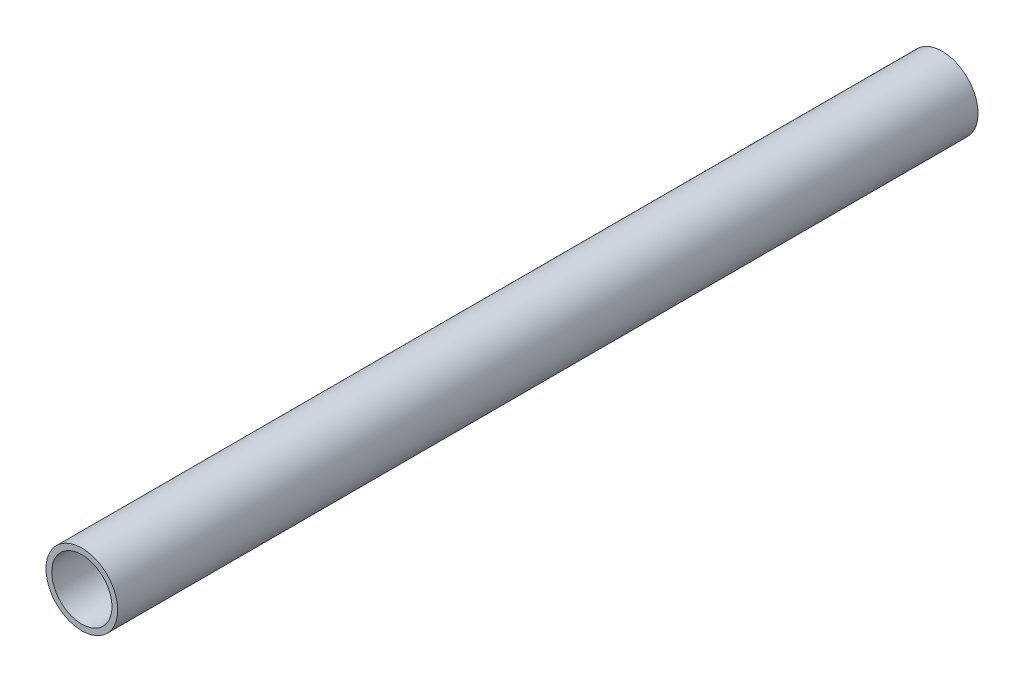
ISO-10303-21;
HEADER;
FILE_DESCRIPTION(('STEP AP214'),'2;1');
FILE_NAME('part.step','',(''),(''),'','','');
FILE_SCHEMA(('AUTOMOTIVE_DESIGN { 1 0 10303 214 1 1 1 1 }'));
ENDSEC;
DATA;
#1=APPLICATION_CONTEXT('core data for automotive mechanical design processes');
#2=APPLICATION_PROTOCOL_DEFINITION('international standard','automotive_design',2000,#1);
#3=PRODUCT_CONTEXT('',#1,'mechanical');
#4=PRODUCT('Part','Part','',(#3));
#5=PRODUCT_RELATED_PRODUCT_CATEGORY('part','',(#4));
#6=PRODUCT_DEFINITION_FORMATION('','',#4);
#7=PRODUCT_DEFINITION_CONTEXT('part definition',#1,'design');
#8=PRODUCT_DEFINITION('design','',#6,#7);
#9=PRODUCT_DEFINITION_SHAPE('','',#8);
#10=(LENGTH_UNIT() NAMED_UNIT(*) SI_UNIT(.MILLI.,.METRE.));
#11=(NAMED_UNIT(*) PLANE_ANGLE_UNIT() SI_UNIT($,.RADIAN.));
#12=(NAMED_UNIT(*) SI_UNIT($,.STERADIAN.) SOLID_ANGLE_UNIT());
#13=UNCERTAINTY_MEASURE_WITH_UNIT(LENGTH_MEASURE(1.E-05),#10,'distance_accuracy_value','');
#14=(GEOMETRIC_REPRESENTATION_CONTEXT(3) GLOBAL_UNCERTAINTY_ASSIGNED_CONTEXT((#13)) GLOBAL_UNIT_ASSIGNED_CONTEXT((#10,
#11,#12)) REPRESENTATION_CONTEXT('',''));
#15=CARTESIAN_POINT('',(0.,0.,0.));
#16=DIRECTION('',(0.,0.,1.));
#17=DIRECTION('',(1.,0.,0.));
#18=AXIS2_PLACEMENT_3D('',#15,#16,#17);
#19=CARTESIAN_POINT('',(0.,0.,304.8));
#20=DIRECTION('',(0.,0.,1.));
#21=DIRECTION('',(1.,0.,0.));
#22=AXIS2_PLACEMENT_3D('',#19,#20,#21);
#23=PLANE('',#22);
#24=CARTESIAN_POINT('',(0.,0.,304.8));
#25=DIRECTION('',(0.,0.,1.));
#26=DIRECTION('',(1.,0.,0.));
#27=AXIS2_PLACEMENT_3D('',#24,#25,#26);
#28=CIRCLE('',#27,12.7);
#29=CARTESIAN_POINT('',(-12.7,0.,304.8));
#30=VERTEX_POINT('',#29);
#31=EDGE_CURVE('E10',#30,#30,#28,.T.);
#32=ORIENTED_EDGE('',*,*,#31,.T.);
#33=EDGE_LOOP('',(#32));
#34=FACE_BOUND('',#33,.T.);
#35=CARTESIAN_POINT('',(0.,0.,304.8));
#36=DIRECTION('',(0.,0.,1.));
#37=DIRECTION('',(1.,0.,0.));
#38=AXIS2_PLACEMENT_3D('',#35,#36,#37);
#39=CIRCLE('',#38,10.668);
#40=CARTESIAN_POINT('',(-10.668,0.,304.8));
#41=VERTEX_POINT('',#40);
#42=EDGE_CURVE('E42',#41,#41,#39,.T.);
#43=ORIENTED_EDGE('',*,*,#42,.F.);
#44=EDGE_LOOP('',(#43));
#45=FACE_BOUND('',#44,.T.);
#46=ADVANCED_FACE('F31',(#34,#45),#23,.T.);
#47=CARTESIAN_POINT('',(0.,0.,0.));
#48=DIRECTION('',(0.,0.,1.));
#49=DIRECTION('',(1.,0.,0.));
#50=AXIS2_PLACEMENT_3D('',#47,#48,#49);
#51=PLANE('',#50);
#52=CARTESIAN_POINT('',(0.,0.,0.));
#53=DIRECTION('',(0.,0.,1.));
#54=DIRECTION('',(1.,0.,0.));
#55=AXIS2_PLACEMENT_3D('',#52,#53,#54);
#56=CIRCLE('',#55,12.7);
#57=CARTESIAN_POINT('',(-12.7,0.,0.));
#58=VERTEX_POINT('',#57);
#59=EDGE_CURVE('E35',#58,#58,#56,.T.);
#60=ORIENTED_EDGE('',*,*,#59,.F.);
#61=EDGE_LOOP('',(#60));
#62=FACE_BOUND('',#61,.T.);
#63=CARTESIAN_POINT('',(0.,0.,0.));
#64=DIRECTION('',(0.,0.,1.));
#65=DIRECTION('',(1.,0.,0.));
#66=AXIS2_PLACEMENT_3D('',#63,#64,#65);
#67=CIRCLE('',#66,10.668);
#68=CARTESIAN_POINT('',(-10.668,0.,0.));
#69=VERTEX_POINT('',#68);
#70=EDGE_CURVE('E44',#69,#69,#67,.T.);
#71=ORIENTED_EDGE('',*,*,#70,.T.);
#72=EDGE_LOOP('',(#71));
#73=FACE_BOUND('',#72,.T.);
#74=ADVANCED_FACE('F54',(#62,#73),#51,.F.);
#75=CARTESIAN_POINT('',(0.,0.,304.8));
#76=DIRECTION('',(0.,0.,-1.));
#77=DIRECTION('',(-1.,0.,0.));
#78=AXIS2_PLACEMENT_3D('',#75,#76,#77);
#79=CYLINDRICAL_SURFACE('',#78,12.7);
#80=CARTESIAN_POINT('',(-12.7,0.,304.8));
#81=CARTESIAN_POINT('',(-12.7,0.,301.625));
#82=CARTESIAN_POINT('',(-12.7,0.,298.45));
#83=CARTESIAN_POINT('',(-12.7,0.,292.1));
#84=CARTESIAN_POINT('',(-12.7,0.,288.925));
#85=CARTESIAN_POINT('',(-12.7,0.,282.575));
#86=CARTESIAN_POINT('',(-12.7,0.,279.4));
#87=CARTESIAN_POINT('',(-12.7,0.,273.05));
#88=CARTESIAN_POINT('',(-12.7,0.,269.875));
#89=CARTESIAN_POINT('',(-12.7,0.,263.525));
#90=CARTESIAN_POINT('',(-12.7,0.,260.35));
#91=CARTESIAN_POINT('',(-12.7,0.,254.));
#92=CARTESIAN_POINT('',(-12.7,0.,250.825));
#93=CARTESIAN_POINT('',(-12.7,0.,244.475));
#94=CARTESIAN_POINT('',(-12.7,0.,241.3));
#95=CARTESIAN_POINT('',(-12.7,0.,234.95));
#96=CARTESIAN_POINT('',(-12.7,0.,231.775));
#97=CARTESIAN_POINT('',(-12.7,0.,225.425));
#98=CARTESIAN_POINT('',(-12.7,0.,222.25));
#99=CARTESIAN_POINT('',(-12.7,0.,215.9));
#100=CARTESIAN_POINT('',(-12.7,0.,212.725));
#101=CARTESIAN_POINT('',(-12.7,0.,206.375));
#102=CARTESIAN_POINT('',(-12.7,0.,203.2));
#103=CARTESIAN_POINT('',(-12.7,0.,196.85));
#104=CARTESIAN_POINT('',(-12.7,0.,193.675));
#105=CARTESIAN_POINT('',(-12.7,0.,187.325));
#106=CARTESIAN_POINT('',(-12.7,0.,184.15));
#107=CARTESIAN_POINT('',(-12.7,0.,177.8));
#108=CARTESIAN_POINT('',(-12.7,0.,174.625));
#109=CARTESIAN_POINT('',(-12.7,0.,168.275));
#110=CARTESIAN_POINT('',(-12.7,0.,165.1));
#111=CARTESIAN_POINT('',(-12.7,0.,158.75));
#112=CARTESIAN_POINT('',(-12.7,0.,155.575));
#113=CARTESIAN_POINT('',(-12.7,0.,149.225));
#114=CARTESIAN_POINT('',(-12.7,0.,146.05));
#115=CARTESIAN_POINT('',(-12.7,0.,139.7));
#116=CARTESIAN_POINT('',(-12.7,0.,136.525));
#117=CARTESIAN_POINT('',(-12.7,0.,130.175));
#118=CARTESIAN_POINT('',(-12.7,0.,127.));
#119=CARTESIAN_POINT('',(-12.7,0.,120.65));
#120=CARTESIAN_POINT('',(-12.7,0.,117.475));
#121=CARTESIAN_POINT('',(-12.7,0.,111.125));
#122=CARTESIAN_POINT('',(-12.7,0.,107.95));
#123=CARTESIAN_POINT('',(-12.7,0.,101.6));
#124=CARTESIAN_POINT('',(-12.7,0.,98.425));
#125=CARTESIAN_POINT('',(-12.7,0.,92.075));
#126=CARTESIAN_POINT('',(-12.7,0.,88.9));
#127=CARTESIAN_POINT('',(-12.7,0.,82.55));
#128=CARTESIAN_POINT('',(-12.7,0.,79.375));
#129=CARTESIAN_POINT('',(-12.7,0.,73.025));
#130=CARTESIAN_POINT('',(-12.7,0.,69.85));
#131=CARTESIAN_POINT('',(-12.7,0.,63.5));
#132=CARTESIAN_POINT('',(-12.7,0.,60.325));
#133=CARTESIAN_POINT('',(-12.7,0.,53.975));
#134=CARTESIAN_POINT('',(-12.7,0.,50.8));
#135=CARTESIAN_POINT('',(-12.7,0.,44.45));
#136=CARTESIAN_POINT('',(-12.7,0.,41.275));
#137=CARTESIAN_POINT('',(-12.7,0.,34.925));
#138=CARTESIAN_POINT('',(-12.7,0.,31.75));
#139=CARTESIAN_POINT('',(-12.7,0.,25.4));
#140=CARTESIAN_POINT('',(-12.7,0.,22.225));
#141=CARTESIAN_POINT('',(-12.7,0.,15.875));
#142=CARTESIAN_POINT('',(-12.7,0.,12.7));
#143=CARTESIAN_POINT('',(-12.7,0.,6.35));
#144=CARTESIAN_POINT('',(-12.7,0.,3.175));
#145=CARTESIAN_POINT('',(-12.7,0.,0.));
#146=B_SPLINE_CURVE_WITH_KNOTS('',3,(#80,#81,#82,#83,#84,#85,#86,#87,#88,#89,#90,#91,#92,#93,
#94,#95,#96,#97,#98,#99,#100,#101,#102,#103,#104,#105,#106,#107,#108,#109,#110,#111,#112,#113,
#114,#115,#116,#117,#118,#119,#120,#121,#122,#123,#124,#125,#126,#127,#128,#129,#130,#131,#132,
#133,#134,#135,#136,#137,#138,#139,#140,#141,#142,#143,#144,#145),.UNSPECIFIED.,.F.,.F.,(4,2,2,
2,2,2,2,2,2,2,2,2,2,2,2,2,2,2,2,2,2,2,2,2,2,2,2,2,2,2,2,2,4),(0.,9.52500000000001,19.05,28.575,
38.1,47.625,57.15,66.675,76.2,85.7250000000001,95.2500000000001,104.775,114.3,123.825,133.35,
142.875,152.4,161.925,171.45,180.975,190.5,200.025,209.55,219.075,228.6,238.125,247.65,257.175,
266.7,276.225,285.75,295.275,304.8),.UNSPECIFIED.);
#147=EDGE_CURVE('BSEAM33',#30,#58,#146,.T.);
#148=ORIENTED_EDGE('',*,*,#31,.F.);
#149=ORIENTED_EDGE('',*,*,#59,.T.);
#150=ORIENTED_EDGE('',*,*,#147,.T.);
#151=ORIENTED_EDGE('',*,*,#147,.F.);
#152=EDGE_LOOP('',(#148,#150,#149,#151));
#153=FACE_BOUND('',#152,.T.);
#154=ADVANCED_FACE('F33',(#153),#79,.T.);
#155=CARTESIAN_POINT('',(0.,0.,304.8));
#156=DIRECTION('',(0.,0.,-1.));
#157=DIRECTION('',(-1.,0.,0.));
#158=AXIS2_PLACEMENT_3D('',#155,#156,#157);
#159=CYLINDRICAL_SURFACE('',#158,10.668);
#160=CARTESIAN_POINT('',(-10.668,0.,304.8));
#161=CARTESIAN_POINT('',(-10.668,0.,301.625));
#162=CARTESIAN_POINT('',(-10.668,0.,298.45));
#163=CARTESIAN_POINT('',(-10.668,0.,292.1));
#164=CARTESIAN_POINT('',(-10.668,0.,288.925));
#165=CARTESIAN_POINT('',(-10.668,0.,282.575));
#166=CARTESIAN_POINT('',(-10.668,0.,279.4));
#167=CARTESIAN_POINT('',(-10.668,0.,273.05));
#168=CARTESIAN_POINT('',(-10.668,0.,269.875));
#169=CARTESIAN_POINT('',(-10.668,0.,263.525));
#170=CARTESIAN_POINT('',(-10.668,0.,260.35));
#171=CARTESIAN_POINT('',(-10.668,0.,254.));
#172=CARTESIAN_POINT('',(-10.668,0.,250.825));
#173=CARTESIAN_POINT('',(-10.668,0.,244.475));
#174=CARTESIAN_POINT('',(-10.668,0.,241.3));
#175=CARTESIAN_POINT('',(-10.668,0.,234.95));
#176=CARTESIAN_POINT('',(-10.668,0.,231.775));
#177=CARTESIAN_POINT('',(-10.668,0.,225.425));
#178=CARTESIAN_POINT('',(-10.668,0.,222.25));
#179=CARTESIAN_POINT('',(-10.668,0.,215.9));
#180=CARTESIAN_POINT('',(-10.668,0.,212.725));
#181=CARTESIAN_POINT('',(-10.668,0.,206.375));
#182=CARTESIAN_POINT('',(-10.668,0.,203.2));
#183=CARTESIAN_POINT('',(-10.668,0.,196.85));
#184=CARTESIAN_POINT('',(-10.668,0.,193.675));
#185=CARTESIAN_POINT('',(-10.668,0.,187.325));
#186=CARTESIAN_POINT('',(-10.668,0.,184.15));
#187=CARTESIAN_POINT('',(-10.668,0.,177.8));
#188=CARTESIAN_POINT('',(-10.668,0.,174.625));
#189=CARTESIAN_POINT('',(-10.668,0.,168.275));
#190=CARTESIAN_POINT('',(-10.668,0.,165.1));
#191=CARTESIAN_POINT('',(-10.668,0.,158.75));
#192=CARTESIAN_POINT('',(-10.668,0.,155.575));
#193=CARTESIAN_POINT('',(-10.668,0.,149.225));
#194=CARTESIAN_POINT('',(-10.668,0.,146.05));
#195=CARTESIAN_POINT('',(-10.668,0.,139.7));
#196=CARTESIAN_POINT('',(-10.668,0.,136.525));
#197=CARTESIAN_POINT('',(-10.668,0.,130.175));
#198=CARTESIAN_POINT('',(-10.668,0.,127.));
#199=CARTESIAN_POINT('',(-10.668,0.,120.65));
#200=CARTESIAN_POINT('',(-10.668,0.,117.475));
#201=CARTESIAN_POINT('',(-10.668,0.,111.125));
#202=CARTESIAN_POINT('',(-10.668,0.,107.95));
#203=CARTESIAN_POINT('',(-10.668,0.,101.6));
#204=CARTESIAN_POINT('',(-10.668,0.,98.425));
#205=CARTESIAN_POINT('',(-10.668,0.,92.075));
#206=CARTESIAN_POINT('',(-10.668,0.,88.9));
#207=CARTESIAN_POINT('',(-10.668,0.,82.55));
#208=CARTESIAN_POINT('',(-10.668,0.,79.375));
#209=CARTESIAN_POINT('',(-10.668,0.,73.025));
#210=CARTESIAN_POINT('',(-10.668,0.,69.85));
#211=CARTESIAN_POINT('',(-10.668,0.,63.5));
#212=CARTESIAN_POINT('',(-10.668,0.,60.325));
#213=CARTESIAN_POINT('',(-10.668,0.,53.975));
#214=CARTESIAN_POINT('',(-10.668,0.,50.8));
#215=CARTESIAN_POINT('',(-10.668,0.,44.45));
#216=CARTESIAN_POINT('',(-10.668,0.,41.275));
#217=CARTESIAN_POINT('',(-10.668,0.,34.925));
#218=CARTESIAN_POINT('',(-10.668,0.,31.75));
#219=CARTESIAN_POINT('',(-10.668,0.,25.4));
#220=CARTESIAN_POINT('',(-10.668,0.,22.225));
#221=CARTESIAN_POINT('',(-10.668,0.,15.875));
#222=CARTESIAN_POINT('',(-10.668,0.,12.7));
#223=CARTESIAN_POINT('',(-10.668,0.,6.35));
#224=CARTESIAN_POINT('',(-10.668,0.,3.175));
#225=CARTESIAN_POINT('',(-10.668,0.,0.));
#226=B_SPLINE_CURVE_WITH_KNOTS('',3,(#160,#161,#162,#163,#164,#165,#166,#167,#168,#169,#170,
#171,#172,#173,#174,#175,#176,#177,#178,#179,#180,#181,#182,#183,#184,#185,#186,#187,#188,#189,
#190,#191,#192,#193,#194,#195,#196,#197,#198,#199,#200,#201,#202,#203,#204,#205,#206,#207,#208,
#209,#210,#211,#212,#213,#214,#215,#216,#217,#218,#219,#220,#221,#222,#223,#224,#225),
.UNSPECIFIED.,.F.,.F.,(4,2,2,2,2,2,2,2,2,2,2,2,2,2,2,2,2,2,2,2,2,2,2,2,2,2,2,2,2,2,2,2,4),(0.,
9.52500000000001,19.05,28.575,38.1,47.625,57.15,66.675,76.2,85.7250000000001,95.2500000000001,
104.775,114.3,123.825,133.35,142.875,152.4,161.925,171.45,180.975,190.5,200.025,209.55,219.075,
228.6,238.125,247.65,257.175,266.7,276.225,285.75,295.275,304.8),.UNSPECIFIED.);
#227=EDGE_CURVE('BSEAM50',#41,#69,#226,.T.);
#228=ORIENTED_EDGE('',*,*,#42,.T.);
#229=ORIENTED_EDGE('',*,*,#70,.F.);
#230=ORIENTED_EDGE('',*,*,#227,.T.);
#231=ORIENTED_EDGE('',*,*,#227,.F.);
#232=EDGE_LOOP('',(#228,#230,#229,#231));
#233=FACE_BOUND('',#232,.T.);
#234=ADVANCED_FACE('F50',(#233),#159,.F.);
#235=CLOSED_SHELL('',(#46,#74,#154,#234));
#236=MANIFOLD_SOLID_BREP('B2',#235);
#237=ADVANCED_BREP_SHAPE_REPRESENTATION('',(#18,#236),#14);
#238=SHAPE_DEFINITION_REPRESENTATION(#9,#237);
ENDSEC;
END-ISO-10303-21;
